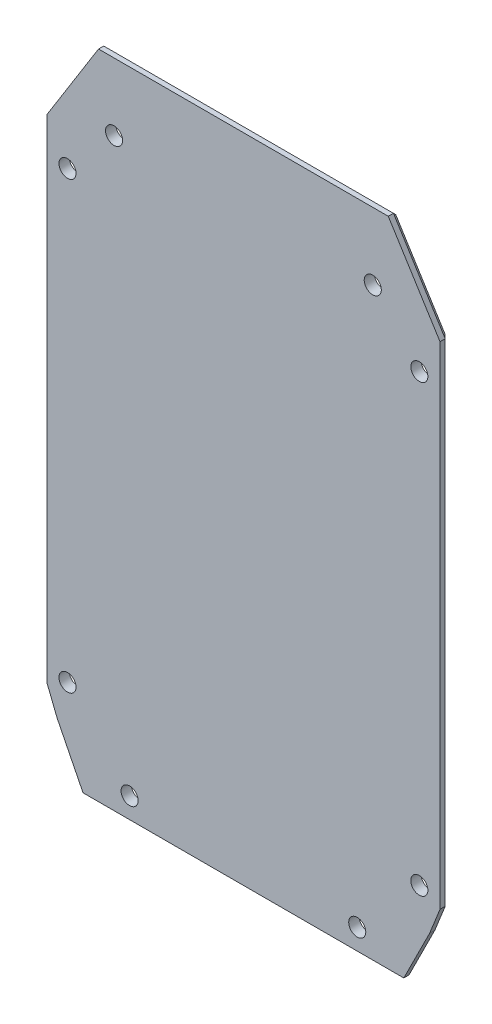
ISO-10303-21;
HEADER;
FILE_DESCRIPTION(('STEP AP214'),'2;1');
FILE_NAME('part.step','',(''),(''),'','','');
FILE_SCHEMA(('AUTOMOTIVE_DESIGN { 1 0 10303 214 1 1 1 1 }'));
ENDSEC;
DATA;
#1=APPLICATION_CONTEXT('core data for automotive mechanical design processes');
#2=APPLICATION_PROTOCOL_DEFINITION('international standard','automotive_design',2000,#1);
#3=PRODUCT_CONTEXT('',#1,'mechanical');
#4=PRODUCT('Part','Part','',(#3));
#5=PRODUCT_RELATED_PRODUCT_CATEGORY('part','',(#4));
#6=PRODUCT_DEFINITION_FORMATION('','',#4);
#7=PRODUCT_DEFINITION_CONTEXT('part definition',#1,'design');
#8=PRODUCT_DEFINITION('design','',#6,#7);
#9=PRODUCT_DEFINITION_SHAPE('','',#8);
#10=(LENGTH_UNIT() NAMED_UNIT(*) SI_UNIT(.MILLI.,.METRE.));
#11=(NAMED_UNIT(*) PLANE_ANGLE_UNIT() SI_UNIT($,.RADIAN.));
#12=(NAMED_UNIT(*) SI_UNIT($,.STERADIAN.) SOLID_ANGLE_UNIT());
#13=UNCERTAINTY_MEASURE_WITH_UNIT(LENGTH_MEASURE(1.E-05),#10,'distance_accuracy_value','');
#14=(GEOMETRIC_REPRESENTATION_CONTEXT(3) GLOBAL_UNCERTAINTY_ASSIGNED_CONTEXT((#13)) GLOBAL_UNIT_ASSIGNED_CONTEXT((#10,
#11,#12)) REPRESENTATION_CONTEXT('',''));
#15=CARTESIAN_POINT('',(0.,0.,0.));
#16=DIRECTION('',(0.,0.,1.));
#17=DIRECTION('',(1.,0.,0.));
#18=AXIS2_PLACEMENT_3D('',#15,#16,#17);
#19=CARTESIAN_POINT('',(0.,0.,2.));
#20=DIRECTION('',(0.,0.,1.));
#21=DIRECTION('',(1.,0.,0.));
#22=AXIS2_PLACEMENT_3D('',#19,#20,#21);
#23=PLANE('',#22);
#24=CARTESIAN_POINT('',(34.,-43.,2.));
#25=DIRECTION('',(0.,0.,1.));
#26=DIRECTION('',(1.,0.,0.));
#27=AXIS2_PLACEMENT_3D('',#24,#25,#26);
#28=CIRCLE('',#27,1.65);
#29=CARTESIAN_POINT('',(35.65,-43.,2.));
#30=VERTEX_POINT('',#29);
#31=EDGE_CURVE('E262',#30,#30,#28,.T.);
#32=ORIENTED_EDGE('',*,*,#31,.F.);
#33=EDGE_LOOP('',(#32));
#34=FACE_BOUND('',#33,.T.);
#35=CARTESIAN_POINT('',(22.,-56.,2.));
#36=DIRECTION('',(0.,0.,1.));
#37=DIRECTION('',(1.,0.,0.));
#38=AXIS2_PLACEMENT_3D('',#35,#36,#37);
#39=CIRCLE('',#38,1.65);
#40=CARTESIAN_POINT('',(23.65,-56.,2.));
#41=VERTEX_POINT('',#40);
#42=EDGE_CURVE('E274',#41,#41,#39,.T.);
#43=ORIENTED_EDGE('',*,*,#42,.F.);
#44=EDGE_LOOP('',(#43));
#45=FACE_BOUND('',#44,.T.);
#46=CARTESIAN_POINT('',(-34.,-43.,2.));
#47=DIRECTION('',(0.,0.,1.));
#48=DIRECTION('',(1.,0.,0.));
#49=AXIS2_PLACEMENT_3D('',#46,#47,#48);
#50=CIRCLE('',#49,1.65);
#51=CARTESIAN_POINT('',(-32.35,-43.,2.));
#52=VERTEX_POINT('',#51);
#53=EDGE_CURVE('E286',#52,#52,#50,.T.);
#54=ORIENTED_EDGE('',*,*,#53,.F.);
#55=EDGE_LOOP('',(#54));
#56=FACE_BOUND('',#55,.T.);
#57=CARTESIAN_POINT('',(-22.,-56.,2.));
#58=DIRECTION('',(0.,0.,1.));
#59=DIRECTION('',(1.,0.,0.));
#60=AXIS2_PLACEMENT_3D('',#57,#58,#59);
#61=CIRCLE('',#60,1.65);
#62=CARTESIAN_POINT('',(-20.35,-56.,2.));
#63=VERTEX_POINT('',#62);
#64=EDGE_CURVE('E173',#63,#63,#61,.T.);
#65=ORIENTED_EDGE('',*,*,#64,.F.);
#66=EDGE_LOOP('',(#65));
#67=FACE_BOUND('',#66,.T.);
#68=DIRECTION('',(0.447213595499958,-0.894427190999916,0.));
#69=VECTOR('',#68,1.);
#70=CARTESIAN_POINT('',(-36.,-50.,2.));
#71=LINE('',#70,#69);
#72=CARTESIAN_POINT('',(-36.,-50.,2.));
#73=VERTEX_POINT('',#72);
#74=CARTESIAN_POINT('',(-31.,-60.,2.));
#75=VERTEX_POINT('',#74);
#76=EDGE_CURVE('E164',#73,#75,#71,.T.);
#77=ORIENTED_EDGE('',*,*,#76,.T.);
#78=DIRECTION('',(1.,0.,0.));
#79=VECTOR('',#78,1.);
#80=CARTESIAN_POINT('',(-31.,-60.,2.));
#81=LINE('',#80,#79);
#82=CARTESIAN_POINT('',(31.,-60.,2.));
#83=VERTEX_POINT('',#82);
#84=EDGE_CURVE('E154',#75,#83,#81,.T.);
#85=ORIENTED_EDGE('',*,*,#84,.T.);
#86=DIRECTION('',(0.447213595499958,0.894427190999916,0.));
#87=VECTOR('',#86,1.);
#88=CARTESIAN_POINT('',(31.,-60.,2.));
#89=LINE('',#88,#87);
#90=CARTESIAN_POINT('',(36.,-50.,2.));
#91=VERTEX_POINT('',#90);
#92=EDGE_CURVE('E163',#83,#91,#89,.T.);
#93=ORIENTED_EDGE('',*,*,#92,.T.);
#94=DIRECTION('',(0.371390676354104,0.928476690885259,0.));
#95=VECTOR('',#94,1.);
#96=CARTESIAN_POINT('',(36.,-50.,2.));
#97=LINE('',#96,#95);
#98=CARTESIAN_POINT('',(38.,-45.,2.));
#99=VERTEX_POINT('',#98);
#100=EDGE_CURVE('E303',#91,#99,#97,.T.);
#101=ORIENTED_EDGE('',*,*,#100,.T.);
#102=DIRECTION('',(0.,1.,0.));
#103=VECTOR('',#102,1.);
#104=CARTESIAN_POINT('',(38.,-45.,2.));
#105=LINE('',#104,#103);
#106=CARTESIAN_POINT('',(38.,50.,2.));
#107=VERTEX_POINT('',#106);
#108=EDGE_CURVE('E305',#99,#107,#105,.T.);
#109=ORIENTED_EDGE('',*,*,#108,.T.);
#110=DIRECTION('',(-0.52999894000318,0.847998304005088,0.));
#111=VECTOR('',#110,1.);
#112=CARTESIAN_POINT('',(38.,50.,2.));
#113=LINE('',#112,#111);
#114=CARTESIAN_POINT('',(28.,66.,2.));
#115=VERTEX_POINT('',#114);
#116=EDGE_CURVE('E307',#107,#115,#113,.T.);
#117=ORIENTED_EDGE('',*,*,#116,.T.);
#118=DIRECTION('',(-1.,0.,0.));
#119=VECTOR('',#118,1.);
#120=CARTESIAN_POINT('',(28.,66.,2.));
#121=LINE('',#120,#119);
#122=CARTESIAN_POINT('',(-28.,66.,2.));
#123=VERTEX_POINT('',#122);
#124=EDGE_CURVE('E309',#115,#123,#121,.T.);
#125=ORIENTED_EDGE('',*,*,#124,.T.);
#126=DIRECTION('',(-0.52999894000318,-0.847998304005088,0.));
#127=VECTOR('',#126,1.);
#128=CARTESIAN_POINT('',(-28.,66.,2.));
#129=LINE('',#128,#127);
#130=CARTESIAN_POINT('',(-38.,50.,2.));
#131=VERTEX_POINT('',#130);
#132=EDGE_CURVE('E311',#123,#131,#129,.T.);
#133=ORIENTED_EDGE('',*,*,#132,.T.);
#134=DIRECTION('',(0.,-1.,0.));
#135=VECTOR('',#134,1.);
#136=CARTESIAN_POINT('',(-38.,50.,2.));
#137=LINE('',#136,#135);
#138=CARTESIAN_POINT('',(-38.,-45.,2.));
#139=VERTEX_POINT('',#138);
#140=EDGE_CURVE('E313',#131,#139,#137,.T.);
#141=ORIENTED_EDGE('',*,*,#140,.T.);
#142=DIRECTION('',(0.371390676354104,-0.928476690885259,0.));
#143=VECTOR('',#142,1.);
#144=CARTESIAN_POINT('',(-38.,-45.,2.));
#145=LINE('',#144,#143);
#146=EDGE_CURVE('E169',#139,#73,#145,.T.);
#147=ORIENTED_EDGE('',*,*,#146,.T.);
#148=EDGE_LOOP('',(#77,#85,#93,#101,#109,#117,#125,#133,#141,#147));
#149=FACE_BOUND('',#148,.T.);
#150=CARTESIAN_POINT('',(-25.,53.,2.));
#151=DIRECTION('',(0.,0.,1.));
#152=DIRECTION('',(1.,0.,0.));
#153=AXIS2_PLACEMENT_3D('',#150,#151,#152);
#154=CIRCLE('',#153,1.65);
#155=CARTESIAN_POINT('',(-23.35,53.,2.));
#156=VERTEX_POINT('',#155);
#157=EDGE_CURVE('E292',#156,#156,#154,.T.);
#158=ORIENTED_EDGE('',*,*,#157,.F.);
#159=EDGE_LOOP('',(#158));
#160=FACE_BOUND('',#159,.T.);
#161=CARTESIAN_POINT('',(-34.,43.,2.));
#162=DIRECTION('',(0.,0.,1.));
#163=DIRECTION('',(1.,0.,0.));
#164=AXIS2_PLACEMENT_3D('',#161,#162,#163);
#165=CIRCLE('',#164,1.65);
#166=CARTESIAN_POINT('',(-32.35,43.,2.));
#167=VERTEX_POINT('',#166);
#168=EDGE_CURVE('E280',#167,#167,#165,.T.);
#169=ORIENTED_EDGE('',*,*,#168,.F.);
#170=EDGE_LOOP('',(#169));
#171=FACE_BOUND('',#170,.T.);
#172=CARTESIAN_POINT('',(25.,53.,2.));
#173=DIRECTION('',(0.,0.,1.));
#174=DIRECTION('',(1.,0.,0.));
#175=AXIS2_PLACEMENT_3D('',#172,#173,#174);
#176=CIRCLE('',#175,1.65);
#177=CARTESIAN_POINT('',(26.65,53.,2.));
#178=VERTEX_POINT('',#177);
#179=EDGE_CURVE('E268',#178,#178,#176,.T.);
#180=ORIENTED_EDGE('',*,*,#179,.F.);
#181=EDGE_LOOP('',(#180));
#182=FACE_BOUND('',#181,.T.);
#183=CARTESIAN_POINT('',(34.,43.,2.));
#184=DIRECTION('',(0.,0.,1.));
#185=DIRECTION('',(1.,0.,0.));
#186=AXIS2_PLACEMENT_3D('',#183,#184,#185);
#187=CIRCLE('',#186,1.65);
#188=CARTESIAN_POINT('',(35.65,43.,2.));
#189=VERTEX_POINT('',#188);
#190=EDGE_CURVE('E254',#189,#189,#187,.T.);
#191=ORIENTED_EDGE('',*,*,#190,.F.);
#192=EDGE_LOOP('',(#191));
#193=FACE_BOUND('',#192,.T.);
#194=ADVANCED_FACE('F43',(#34,#45,#56,#67,#149,#160,#171,#182,#193),#23,.T.);
#195=CARTESIAN_POINT('',(0.,0.,0.));
#196=DIRECTION('',(0.,0.,1.));
#197=DIRECTION('',(1.,0.,0.));
#198=AXIS2_PLACEMENT_3D('',#195,#196,#197);
#199=PLANE('',#198);
#200=DIRECTION('',(-1.,0.,0.));
#201=VECTOR('',#200,1.);
#202=CARTESIAN_POINT('',(0.,-59.,0.));
#203=LINE('',#202,#201);
#204=CARTESIAN_POINT('',(30.3819660112501,-59.,0.));
#205=VERTEX_POINT('',#204);
#206=CARTESIAN_POINT('',(-30.3819660112501,-59.,0.));
#207=VERTEX_POINT('',#206);
#208=EDGE_CURVE('E201',#205,#207,#203,.T.);
#209=ORIENTED_EDGE('',*,*,#208,.T.);
#210=DIRECTION('',(-0.447213595499958,0.894427190999916,0.));
#211=VECTOR('',#210,1.);
#212=CARTESIAN_POINT('',(-47.9055728090001,-23.9527864045,0.));
#213=LINE('',#212,#211);
#214=CARTESIAN_POINT('',(-35.0869711478651,-49.58998972677,0.));
#215=VERTEX_POINT('',#214);
#216=EDGE_CURVE('E203',#207,#215,#213,.T.);
#217=ORIENTED_EDGE('',*,*,#216,.T.);
#218=DIRECTION('',(-0.371390676354104,0.928476690885259,0.));
#219=VECTOR('',#218,1.);
#220=CARTESIAN_POINT('',(-47.3473853780803,-18.9389541512321,0.));
#221=LINE('',#220,#219);
#222=CARTESIAN_POINT('',(-37.,-44.8074175964327,0.));
#223=VERTEX_POINT('',#222);
#224=EDGE_CURVE('E180',#215,#223,#221,.T.);
#225=ORIENTED_EDGE('',*,*,#224,.T.);
#226=DIRECTION('',(0.,1.,0.));
#227=VECTOR('',#226,1.);
#228=CARTESIAN_POINT('',(-37.,0.,0.));
#229=LINE('',#228,#227);
#230=CARTESIAN_POINT('',(-37.,49.7132037735887,0.));
#231=VERTEX_POINT('',#230);
#232=EDGE_CURVE('E187',#223,#231,#229,.T.);
#233=ORIENTED_EDGE('',*,*,#232,.T.);
#234=DIRECTION('',(0.52999894000318,0.847998304005088,0.));
#235=VECTOR('',#234,1.);
#236=CARTESIAN_POINT('',(-48.9497545049837,30.5935965656148,0.));
#237=LINE('',#236,#235);
#238=CARTESIAN_POINT('',(-27.4457523584929,65.,0.));
#239=VERTEX_POINT('',#238);
#240=EDGE_CURVE('E189',#231,#239,#237,.T.);
#241=ORIENTED_EDGE('',*,*,#240,.T.);
#242=DIRECTION('',(1.,0.,0.));
#243=VECTOR('',#242,1.);
#244=CARTESIAN_POINT('',(0.,65.,0.));
#245=LINE('',#244,#243);
#246=CARTESIAN_POINT('',(27.4457523584929,65.,0.));
#247=VERTEX_POINT('',#246);
#248=EDGE_CURVE('E191',#239,#247,#245,.T.);
#249=ORIENTED_EDGE('',*,*,#248,.T.);
#250=DIRECTION('',(0.52999894000318,-0.847998304005088,0.));
#251=VECTOR('',#250,1.);
#252=CARTESIAN_POINT('',(48.9497545049837,30.5935965656148,0.));
#253=LINE('',#252,#251);
#254=CARTESIAN_POINT('',(37.,49.7132037735887,0.));
#255=VERTEX_POINT('',#254);
#256=EDGE_CURVE('E193',#247,#255,#253,.T.);
#257=ORIENTED_EDGE('',*,*,#256,.T.);
#258=DIRECTION('',(0.,-1.,0.));
#259=VECTOR('',#258,1.);
#260=CARTESIAN_POINT('',(37.,0.,0.));
#261=LINE('',#260,#259);
#262=CARTESIAN_POINT('',(37.,-44.8074175964327,0.));
#263=VERTEX_POINT('',#262);
#264=EDGE_CURVE('E195',#255,#263,#261,.T.);
#265=ORIENTED_EDGE('',*,*,#264,.T.);
#266=DIRECTION('',(-0.371390676354104,-0.928476690885259,0.));
#267=VECTOR('',#266,1.);
#268=CARTESIAN_POINT('',(47.3473853780803,-18.9389541512321,0.));
#269=LINE('',#268,#267);
#270=CARTESIAN_POINT('',(35.0869711478651,-49.5899897267701,0.));
#271=VERTEX_POINT('',#270);
#272=EDGE_CURVE('E197',#263,#271,#269,.T.);
#273=ORIENTED_EDGE('',*,*,#272,.T.);
#274=DIRECTION('',(-0.447213595499958,-0.894427190999916,0.));
#275=VECTOR('',#274,1.);
#276=CARTESIAN_POINT('',(47.9055728090001,-23.9527864045,0.));
#277=LINE('',#276,#275);
#278=EDGE_CURVE('E199',#271,#205,#277,.T.);
#279=ORIENTED_EDGE('',*,*,#278,.T.);
#280=EDGE_LOOP('',(#209,#217,#225,#233,#241,#249,#257,#265,#273,#279));
#281=FACE_BOUND('',#280,.T.);
#282=CARTESIAN_POINT('',(-22.,-56.,0.));
#283=DIRECTION('',(0.,0.,1.));
#284=DIRECTION('',(1.,0.,0.));
#285=AXIS2_PLACEMENT_3D('',#282,#283,#284);
#286=CIRCLE('',#285,1.65);
#287=CARTESIAN_POINT('',(-20.35,-56.,0.));
#288=VERTEX_POINT('',#287);
#289=EDGE_CURVE('E295',#288,#288,#286,.T.);
#290=ORIENTED_EDGE('',*,*,#289,.T.);
#291=EDGE_LOOP('',(#290));
#292=FACE_BOUND('',#291,.T.);
#293=CARTESIAN_POINT('',(-25.,53.,0.));
#294=DIRECTION('',(0.,0.,1.));
#295=DIRECTION('',(1.,0.,0.));
#296=AXIS2_PLACEMENT_3D('',#293,#294,#295);
#297=CIRCLE('',#296,1.65);
#298=CARTESIAN_POINT('',(-23.35,53.,0.));
#299=VERTEX_POINT('',#298);
#300=EDGE_CURVE('E289',#299,#299,#297,.T.);
#301=ORIENTED_EDGE('',*,*,#300,.T.);
#302=EDGE_LOOP('',(#301));
#303=FACE_BOUND('',#302,.T.);
#304=CARTESIAN_POINT('',(-34.,-43.,0.));
#305=DIRECTION('',(0.,0.,1.));
#306=DIRECTION('',(1.,0.,0.));
#307=AXIS2_PLACEMENT_3D('',#304,#305,#306);
#308=CIRCLE('',#307,1.65);
#309=CARTESIAN_POINT('',(-32.35,-43.,0.));
#310=VERTEX_POINT('',#309);
#311=EDGE_CURVE('E283',#310,#310,#308,.T.);
#312=ORIENTED_EDGE('',*,*,#311,.T.);
#313=EDGE_LOOP('',(#312));
#314=FACE_BOUND('',#313,.T.);
#315=CARTESIAN_POINT('',(-34.,43.,0.));
#316=DIRECTION('',(0.,0.,1.));
#317=DIRECTION('',(1.,0.,0.));
#318=AXIS2_PLACEMENT_3D('',#315,#316,#317);
#319=CIRCLE('',#318,1.65);
#320=CARTESIAN_POINT('',(-32.35,43.,0.));
#321=VERTEX_POINT('',#320);
#322=EDGE_CURVE('E277',#321,#321,#319,.T.);
#323=ORIENTED_EDGE('',*,*,#322,.T.);
#324=EDGE_LOOP('',(#323));
#325=FACE_BOUND('',#324,.T.);
#326=CARTESIAN_POINT('',(22.,-56.,0.));
#327=DIRECTION('',(0.,0.,1.));
#328=DIRECTION('',(1.,0.,0.));
#329=AXIS2_PLACEMENT_3D('',#326,#327,#328);
#330=CIRCLE('',#329,1.65);
#331=CARTESIAN_POINT('',(23.65,-56.,0.));
#332=VERTEX_POINT('',#331);
#333=EDGE_CURVE('E271',#332,#332,#330,.T.);
#334=ORIENTED_EDGE('',*,*,#333,.T.);
#335=EDGE_LOOP('',(#334));
#336=FACE_BOUND('',#335,.T.);
#337=CARTESIAN_POINT('',(25.,53.,0.));
#338=DIRECTION('',(0.,0.,1.));
#339=DIRECTION('',(1.,0.,0.));
#340=AXIS2_PLACEMENT_3D('',#337,#338,#339);
#341=CIRCLE('',#340,1.65);
#342=CARTESIAN_POINT('',(26.65,53.,0.));
#343=VERTEX_POINT('',#342);
#344=EDGE_CURVE('E265',#343,#343,#341,.T.);
#345=ORIENTED_EDGE('',*,*,#344,.T.);
#346=EDGE_LOOP('',(#345));
#347=FACE_BOUND('',#346,.T.);
#348=CARTESIAN_POINT('',(34.,-43.,0.));
#349=DIRECTION('',(0.,0.,1.));
#350=DIRECTION('',(1.,0.,0.));
#351=AXIS2_PLACEMENT_3D('',#348,#349,#350);
#352=CIRCLE('',#351,1.65);
#353=CARTESIAN_POINT('',(35.65,-43.,0.));
#354=VERTEX_POINT('',#353);
#355=EDGE_CURVE('E259',#354,#354,#352,.T.);
#356=ORIENTED_EDGE('',*,*,#355,.T.);
#357=EDGE_LOOP('',(#356));
#358=FACE_BOUND('',#357,.T.);
#359=CARTESIAN_POINT('',(34.,43.,0.));
#360=DIRECTION('',(0.,0.,1.));
#361=DIRECTION('',(1.,0.,0.));
#362=AXIS2_PLACEMENT_3D('',#359,#360,#361);
#363=CIRCLE('',#362,1.65);
#364=CARTESIAN_POINT('',(35.65,43.,0.));
#365=VERTEX_POINT('',#364);
#366=EDGE_CURVE('E248',#365,#365,#363,.T.);
#367=ORIENTED_EDGE('',*,*,#366,.T.);
#368=EDGE_LOOP('',(#367));
#369=FACE_BOUND('',#368,.T.);
#370=ADVANCED_FACE('F352',(#281,#292,#303,#314,#325,#336,#347,#358,#369),#199,.F.);
#371=CARTESIAN_POINT('',(-36.,-50.,2.));
#372=DIRECTION('',(0.894427190999916,0.447213595499958,0.));
#373=DIRECTION('',(-0.447213595499958,0.894427190999916,0.));
#374=AXIS2_PLACEMENT_3D('',#371,#372,#373);
#375=PLANE('',#374);
#376=DIRECTION('',(0.,0.,-1.));
#377=VECTOR('',#376,1.);
#378=CARTESIAN_POINT('',(-36.,-50.,2.));
#379=LINE('',#378,#377);
#380=CARTESIAN_POINT('',(-36.,-50.,0.999999999999987));
#381=VERTEX_POINT('',#380);
#382=EDGE_CURVE('E316',#73,#381,#379,.T.);
#383=ORIENTED_EDGE('',*,*,#382,.T.);
#384=DIRECTION('',(0.447213595499958,-0.894427190999916,0.));
#385=VECTOR('',#384,1.);
#386=CARTESIAN_POINT('',(-36.,-50.,0.999999999999987));
#387=LINE('',#386,#385);
#388=CARTESIAN_POINT('',(-31.,-60.,0.999999999999987));
#389=VERTEX_POINT('',#388);
#390=EDGE_CURVE('E178',#381,#389,#387,.T.);
#391=ORIENTED_EDGE('',*,*,#390,.T.);
#392=DIRECTION('',(0.,0.,-1.));
#393=VECTOR('',#392,1.);
#394=CARTESIAN_POINT('',(-31.,-60.,2.));
#395=LINE('',#394,#393);
#396=EDGE_CURVE('E158',#75,#389,#395,.T.);
#397=ORIENTED_EDGE('',*,*,#396,.F.);
#398=ORIENTED_EDGE('',*,*,#76,.F.);
#399=EDGE_LOOP('',(#383,#391,#397,#398));
#400=FACE_BOUND('',#399,.T.);
#401=ADVANCED_FACE('F176',(#400),#375,.F.);
#402=CARTESIAN_POINT('',(-31.,-60.,2.));
#403=DIRECTION('',(0.,1.,0.));
#404=DIRECTION('',(0.,0.,1.));
#405=AXIS2_PLACEMENT_3D('',#402,#403,#404);
#406=PLANE('',#405);
#407=ORIENTED_EDGE('',*,*,#396,.T.);
#408=DIRECTION('',(1.,0.,0.));
#409=VECTOR('',#408,1.);
#410=CARTESIAN_POINT('',(-31.,-60.,0.999999999999987));
#411=LINE('',#410,#409);
#412=CARTESIAN_POINT('',(31.,-60.,0.999999999999987));
#413=VERTEX_POINT('',#412);
#414=EDGE_CURVE('E206',#389,#413,#411,.T.);
#415=ORIENTED_EDGE('',*,*,#414,.T.);
#416=DIRECTION('',(0.,0.,-1.));
#417=VECTOR('',#416,1.);
#418=CARTESIAN_POINT('',(31.,-60.,2.));
#419=LINE('',#418,#417);
#420=EDGE_CURVE('E160',#83,#413,#419,.T.);
#421=ORIENTED_EDGE('',*,*,#420,.F.);
#422=ORIENTED_EDGE('',*,*,#84,.F.);
#423=EDGE_LOOP('',(#407,#415,#421,#422));
#424=FACE_BOUND('',#423,.T.);
#425=ADVANCED_FACE('F156',(#424),#406,.F.);
#426=CARTESIAN_POINT('',(31.,-60.,2.));
#427=DIRECTION('',(-0.894427190999916,0.447213595499958,0.));
#428=DIRECTION('',(-0.447213595499958,-0.894427190999916,0.));
#429=AXIS2_PLACEMENT_3D('',#426,#427,#428);
#430=PLANE('',#429);
#431=ORIENTED_EDGE('',*,*,#420,.T.);
#432=DIRECTION('',(0.447213595499958,0.894427190999916,0.));
#433=VECTOR('',#432,1.);
#434=CARTESIAN_POINT('',(31.,-60.,0.999999999999987));
#435=LINE('',#434,#433);
#436=CARTESIAN_POINT('',(36.,-50.,0.999999999999987));
#437=VERTEX_POINT('',#436);
#438=EDGE_CURVE('E208',#413,#437,#435,.T.);
#439=ORIENTED_EDGE('',*,*,#438,.T.);
#440=DIRECTION('',(0.,0.,-1.));
#441=VECTOR('',#440,1.);
#442=CARTESIAN_POINT('',(36.,-50.,2.));
#443=LINE('',#442,#441);
#444=EDGE_CURVE('E182',#91,#437,#443,.T.);
#445=ORIENTED_EDGE('',*,*,#444,.F.);
#446=ORIENTED_EDGE('',*,*,#92,.F.);
#447=EDGE_LOOP('',(#431,#439,#445,#446));
#448=FACE_BOUND('',#447,.T.);
#449=ADVANCED_FACE('F376',(#448),#430,.F.);
#450=CARTESIAN_POINT('',(36.,-50.,2.));
#451=DIRECTION('',(-0.928476690885259,0.371390676354104,0.));
#452=DIRECTION('',(-0.371390676354104,-0.928476690885259,0.));
#453=AXIS2_PLACEMENT_3D('',#450,#451,#452);
#454=PLANE('',#453);
#455=ORIENTED_EDGE('',*,*,#444,.T.);
#456=DIRECTION('',(0.371390676354104,0.928476690885259,0.));
#457=VECTOR('',#456,1.);
#458=CARTESIAN_POINT('',(36.,-50.,0.999999999999987));
#459=LINE('',#458,#457);
#460=CARTESIAN_POINT('',(38.,-45.,0.999999999999987));
#461=VERTEX_POINT('',#460);
#462=EDGE_CURVE('E210',#437,#461,#459,.T.);
#463=ORIENTED_EDGE('',*,*,#462,.T.);
#464=DIRECTION('',(0.,0.,-1.));
#465=VECTOR('',#464,1.);
#466=CARTESIAN_POINT('',(38.,-45.,2.));
#467=LINE('',#466,#465);
#468=EDGE_CURVE('E330',#99,#461,#467,.T.);
#469=ORIENTED_EDGE('',*,*,#468,.F.);
#470=ORIENTED_EDGE('',*,*,#100,.F.);
#471=EDGE_LOOP('',(#455,#463,#469,#470));
#472=FACE_BOUND('',#471,.T.);
#473=ADVANCED_FACE('F337',(#472),#454,.F.);
#474=CARTESIAN_POINT('',(38.,-45.,2.));
#475=DIRECTION('',(-1.,0.,0.));
#476=DIRECTION('',(0.,0.,1.));
#477=AXIS2_PLACEMENT_3D('',#474,#475,#476);
#478=PLANE('',#477);
#479=ORIENTED_EDGE('',*,*,#468,.T.);
#480=DIRECTION('',(0.,1.,0.));
#481=VECTOR('',#480,1.);
#482=CARTESIAN_POINT('',(38.,-45.,0.999999999999987));
#483=LINE('',#482,#481);
#484=CARTESIAN_POINT('',(38.,50.,0.999999999999984));
#485=VERTEX_POINT('',#484);
#486=EDGE_CURVE('E212',#461,#485,#483,.T.);
#487=ORIENTED_EDGE('',*,*,#486,.T.);
#488=DIRECTION('',(0.,0.,-1.));
#489=VECTOR('',#488,1.);
#490=CARTESIAN_POINT('',(38.,50.,2.));
#491=LINE('',#490,#489);
#492=EDGE_CURVE('E327',#107,#485,#491,.T.);
#493=ORIENTED_EDGE('',*,*,#492,.F.);
#494=ORIENTED_EDGE('',*,*,#108,.F.);
#495=EDGE_LOOP('',(#479,#487,#493,#494));
#496=FACE_BOUND('',#495,.T.);
#497=ADVANCED_FACE('F359',(#496),#478,.F.);
#498=CARTESIAN_POINT('',(38.,50.,2.));
#499=DIRECTION('',(-0.847998304005088,-0.52999894000318,0.));
#500=DIRECTION('',(0.52999894000318,-0.847998304005088,0.));
#501=AXIS2_PLACEMENT_3D('',#498,#499,#500);
#502=PLANE('',#501);
#503=ORIENTED_EDGE('',*,*,#492,.T.);
#504=DIRECTION('',(-0.52999894000318,0.847998304005088,0.));
#505=VECTOR('',#504,1.);
#506=CARTESIAN_POINT('',(38.,50.,0.999999999999984));
#507=LINE('',#506,#505);
#508=CARTESIAN_POINT('',(28.,66.,0.999999999999987));
#509=VERTEX_POINT('',#508);
#510=EDGE_CURVE('E214',#485,#509,#507,.T.);
#511=ORIENTED_EDGE('',*,*,#510,.T.);
#512=DIRECTION('',(0.,0.,-1.));
#513=VECTOR('',#512,1.);
#514=CARTESIAN_POINT('',(28.,66.,2.));
#515=LINE('',#514,#513);
#516=EDGE_CURVE('E324',#115,#509,#515,.T.);
#517=ORIENTED_EDGE('',*,*,#516,.F.);
#518=ORIENTED_EDGE('',*,*,#116,.F.);
#519=EDGE_LOOP('',(#503,#511,#517,#518));
#520=FACE_BOUND('',#519,.T.);
#521=ADVANCED_FACE('F364',(#520),#502,.F.);
#522=CARTESIAN_POINT('',(28.,66.,2.));
#523=DIRECTION('',(0.,-1.,0.));
#524=DIRECTION('',(0.,0.,-1.));
#525=AXIS2_PLACEMENT_3D('',#522,#523,#524);
#526=PLANE('',#525);
#527=ORIENTED_EDGE('',*,*,#516,.T.);
#528=DIRECTION('',(-1.,0.,0.));
#529=VECTOR('',#528,1.);
#530=CARTESIAN_POINT('',(28.,66.,0.999999999999987));
#531=LINE('',#530,#529);
#532=CARTESIAN_POINT('',(-28.,66.,0.999999999999988));
#533=VERTEX_POINT('',#532);
#534=EDGE_CURVE('E216',#509,#533,#531,.T.);
#535=ORIENTED_EDGE('',*,*,#534,.T.);
#536=DIRECTION('',(0.,0.,-1.));
#537=VECTOR('',#536,1.);
#538=CARTESIAN_POINT('',(-28.,66.,2.));
#539=LINE('',#538,#537);
#540=EDGE_CURVE('E322',#123,#533,#539,.T.);
#541=ORIENTED_EDGE('',*,*,#540,.F.);
#542=ORIENTED_EDGE('',*,*,#124,.F.);
#543=EDGE_LOOP('',(#527,#535,#541,#542));
#544=FACE_BOUND('',#543,.T.);
#545=ADVANCED_FACE('F371',(#544),#526,.F.);
#546=CARTESIAN_POINT('',(-28.,66.,2.));
#547=DIRECTION('',(0.847998304005088,-0.52999894000318,0.));
#548=DIRECTION('',(0.52999894000318,0.847998304005088,0.));
#549=AXIS2_PLACEMENT_3D('',#546,#547,#548);
#550=PLANE('',#549);
#551=ORIENTED_EDGE('',*,*,#540,.T.);
#552=DIRECTION('',(-0.52999894000318,-0.847998304005088,0.));
#553=VECTOR('',#552,1.);
#554=CARTESIAN_POINT('',(-28.,66.,0.999999999999988));
#555=LINE('',#554,#553);
#556=CARTESIAN_POINT('',(-38.,50.,0.999999999999987));
#557=VERTEX_POINT('',#556);
#558=EDGE_CURVE('E68',#533,#557,#555,.T.);
#559=ORIENTED_EDGE('',*,*,#558,.T.);
#560=DIRECTION('',(0.,0.,-1.));
#561=VECTOR('',#560,1.);
#562=CARTESIAN_POINT('',(-38.,50.,2.));
#563=LINE('',#562,#561);
#564=EDGE_CURVE('E320',#131,#557,#563,.T.);
#565=ORIENTED_EDGE('',*,*,#564,.F.);
#566=ORIENTED_EDGE('',*,*,#132,.F.);
#567=EDGE_LOOP('',(#551,#559,#565,#566));
#568=FACE_BOUND('',#567,.T.);
#569=ADVANCED_FACE('F374',(#568),#550,.F.);
#570=CARTESIAN_POINT('',(-38.,50.,2.));
#571=DIRECTION('',(1.,0.,0.));
#572=DIRECTION('',(0.,0.,-1.));
#573=AXIS2_PLACEMENT_3D('',#570,#571,#572);
#574=PLANE('',#573);
#575=ORIENTED_EDGE('',*,*,#564,.T.);
#576=DIRECTION('',(0.,-1.,0.));
#577=VECTOR('',#576,1.);
#578=CARTESIAN_POINT('',(-38.,50.,0.999999999999987));
#579=LINE('',#578,#577);
#580=CARTESIAN_POINT('',(-38.,-45.,0.999999999999987));
#581=VERTEX_POINT('',#580);
#582=EDGE_CURVE('E53',#557,#581,#579,.T.);
#583=ORIENTED_EDGE('',*,*,#582,.T.);
#584=DIRECTION('',(0.,0.,-1.));
#585=VECTOR('',#584,1.);
#586=CARTESIAN_POINT('',(-38.,-45.,2.));
#587=LINE('',#586,#585);
#588=EDGE_CURVE('E318',#139,#581,#587,.T.);
#589=ORIENTED_EDGE('',*,*,#588,.F.);
#590=ORIENTED_EDGE('',*,*,#140,.F.);
#591=EDGE_LOOP('',(#575,#583,#589,#590));
#592=FACE_BOUND('',#591,.T.);
#593=ADVANCED_FACE('F401',(#592),#574,.F.);
#594=CARTESIAN_POINT('',(-38.,-45.,2.));
#595=DIRECTION('',(0.928476690885259,0.371390676354104,0.));
#596=DIRECTION('',(-0.371390676354104,0.928476690885259,0.));
#597=AXIS2_PLACEMENT_3D('',#594,#595,#596);
#598=PLANE('',#597);
#599=ORIENTED_EDGE('',*,*,#588,.T.);
#600=DIRECTION('',(0.371390676354104,-0.928476690885259,0.));
#601=VECTOR('',#600,1.);
#602=CARTESIAN_POINT('',(-38.,-45.,0.999999999999987));
#603=LINE('',#602,#601);
#604=EDGE_CURVE('E11',#581,#381,#603,.T.);
#605=ORIENTED_EDGE('',*,*,#604,.T.);
#606=ORIENTED_EDGE('',*,*,#382,.F.);
#607=ORIENTED_EDGE('',*,*,#146,.F.);
#608=EDGE_LOOP('',(#599,#605,#606,#607));
#609=FACE_BOUND('',#608,.T.);
#610=ADVANCED_FACE('F398',(#609),#598,.F.);
#611=CARTESIAN_POINT('',(-22.,-56.,2.));
#612=DIRECTION('',(0.,0.,-1.));
#613=DIRECTION('',(-1.,0.,0.));
#614=AXIS2_PLACEMENT_3D('',#611,#612,#613);
#615=CYLINDRICAL_SURFACE('',#614,1.65);
#616=ORIENTED_EDGE('',*,*,#64,.T.);
#617=EDGE_LOOP('',(#616));
#618=FACE_BOUND('',#617,.T.);
#619=ORIENTED_EDGE('',*,*,#289,.F.);
#620=EDGE_LOOP('',(#619));
#621=FACE_BOUND('',#620,.T.);
#622=ADVANCED_FACE('F395',(#618,#621),#615,.F.);
#623=CARTESIAN_POINT('',(-25.,53.,2.));
#624=DIRECTION('',(0.,0.,-1.));
#625=DIRECTION('',(-1.,0.,0.));
#626=AXIS2_PLACEMENT_3D('',#623,#624,#625);
#627=CYLINDRICAL_SURFACE('',#626,1.65);
#628=ORIENTED_EDGE('',*,*,#157,.T.);
#629=EDGE_LOOP('',(#628));
#630=FACE_BOUND('',#629,.T.);
#631=ORIENTED_EDGE('',*,*,#300,.F.);
#632=EDGE_LOOP('',(#631));
#633=FACE_BOUND('',#632,.T.);
#634=ADVANCED_FACE('F443',(#630,#633),#627,.F.);
#635=CARTESIAN_POINT('',(-34.,-43.,2.));
#636=DIRECTION('',(0.,0.,-1.));
#637=DIRECTION('',(-1.,0.,0.));
#638=AXIS2_PLACEMENT_3D('',#635,#636,#637);
#639=CYLINDRICAL_SURFACE('',#638,1.65);
#640=ORIENTED_EDGE('',*,*,#53,.T.);
#641=EDGE_LOOP('',(#640));
#642=FACE_BOUND('',#641,.T.);
#643=ORIENTED_EDGE('',*,*,#311,.F.);
#644=EDGE_LOOP('',(#643));
#645=FACE_BOUND('',#644,.T.);
#646=ADVANCED_FACE('F450',(#642,#645),#639,.F.);
#647=CARTESIAN_POINT('',(-34.,43.,2.));
#648=DIRECTION('',(0.,0.,-1.));
#649=DIRECTION('',(-1.,0.,0.));
#650=AXIS2_PLACEMENT_3D('',#647,#648,#649);
#651=CYLINDRICAL_SURFACE('',#650,1.65);
#652=ORIENTED_EDGE('',*,*,#168,.T.);
#653=EDGE_LOOP('',(#652));
#654=FACE_BOUND('',#653,.T.);
#655=ORIENTED_EDGE('',*,*,#322,.F.);
#656=EDGE_LOOP('',(#655));
#657=FACE_BOUND('',#656,.T.);
#658=ADVANCED_FACE('F457',(#654,#657),#651,.F.);
#659=CARTESIAN_POINT('',(22.,-56.,2.));
#660=DIRECTION('',(0.,0.,-1.));
#661=DIRECTION('',(-1.,0.,0.));
#662=AXIS2_PLACEMENT_3D('',#659,#660,#661);
#663=CYLINDRICAL_SURFACE('',#662,1.65);
#664=ORIENTED_EDGE('',*,*,#42,.T.);
#665=EDGE_LOOP('',(#664));
#666=FACE_BOUND('',#665,.T.);
#667=ORIENTED_EDGE('',*,*,#333,.F.);
#668=EDGE_LOOP('',(#667));
#669=FACE_BOUND('',#668,.T.);
#670=ADVANCED_FACE('F465',(#666,#669),#663,.F.);
#671=CARTESIAN_POINT('',(25.,53.,2.));
#672=DIRECTION('',(0.,0.,-1.));
#673=DIRECTION('',(-1.,0.,0.));
#674=AXIS2_PLACEMENT_3D('',#671,#672,#673);
#675=CYLINDRICAL_SURFACE('',#674,1.65);
#676=ORIENTED_EDGE('',*,*,#179,.T.);
#677=EDGE_LOOP('',(#676));
#678=FACE_BOUND('',#677,.T.);
#679=ORIENTED_EDGE('',*,*,#344,.F.);
#680=EDGE_LOOP('',(#679));
#681=FACE_BOUND('',#680,.T.);
#682=ADVANCED_FACE('F473',(#678,#681),#675,.F.);
#683=CARTESIAN_POINT('',(34.,-43.,2.));
#684=DIRECTION('',(0.,0.,-1.));
#685=DIRECTION('',(-1.,0.,0.));
#686=AXIS2_PLACEMENT_3D('',#683,#684,#685);
#687=CYLINDRICAL_SURFACE('',#686,1.65);
#688=ORIENTED_EDGE('',*,*,#31,.T.);
#689=EDGE_LOOP('',(#688));
#690=FACE_BOUND('',#689,.T.);
#691=ORIENTED_EDGE('',*,*,#355,.F.);
#692=EDGE_LOOP('',(#691));
#693=FACE_BOUND('',#692,.T.);
#694=ADVANCED_FACE('F481',(#690,#693),#687,.F.);
#695=CARTESIAN_POINT('',(34.,43.,2.));
#696=DIRECTION('',(0.,0.,-1.));
#697=DIRECTION('',(-1.,0.,0.));
#698=AXIS2_PLACEMENT_3D('',#695,#696,#697);
#699=CYLINDRICAL_SURFACE('',#698,1.65);
#700=ORIENTED_EDGE('',*,*,#190,.T.);
#701=EDGE_LOOP('',(#700));
#702=FACE_BOUND('',#701,.T.);
#703=ORIENTED_EDGE('',*,*,#366,.F.);
#704=EDGE_LOOP('',(#703));
#705=FACE_BOUND('',#704,.T.);
#706=ADVANCED_FACE('F489',(#702,#705),#699,.F.);
#707=CARTESIAN_POINT('',(38.,50.,0.999999999999987));
#708=DIRECTION('',(-0.599625351196685,-0.374765844497928,0.707106781186552));
#709=DIRECTION('',(-0.52999894000318,0.847998304005088,0.));
#710=AXIS2_PLACEMENT_3D('',#707,#708,#709);
#711=PLANE('',#710);
#712=DIRECTION('',(-0.693000181219913,-0.19874983687625,-0.693000181219913));
#713=VECTOR('',#712,1.);
#714=CARTESIAN_POINT('',(38.,50.,0.999999999999987));
#715=LINE('',#714,#713);
#716=EDGE_CURVE('E241',#255,#485,#715,.F.);
#717=ORIENTED_EDGE('',*,*,#716,.F.);
#718=ORIENTED_EDGE('',*,*,#256,.F.);
#719=DIRECTION('',(-0.364890142623934,-0.658352179238394,-0.658352179238394));
#720=VECTOR('',#719,1.);
#721=CARTESIAN_POINT('',(28.,66.,0.999999999999987));
#722=LINE('',#721,#720);
#723=EDGE_CURVE('E48',#509,#247,#722,.T.);
#724=ORIENTED_EDGE('',*,*,#723,.F.);
#725=ORIENTED_EDGE('',*,*,#510,.F.);
#726=EDGE_LOOP('',(#717,#718,#724,#725));
#727=FACE_BOUND('',#726,.T.);
#728=ADVANCED_FACE('F46',(#727),#711,.F.);
#729=CARTESIAN_POINT('',(28.,66.,0.999999999999987));
#730=DIRECTION('',(0.,-0.707106781186547,0.707106781186547));
#731=DIRECTION('',(-1.,0.,0.));
#732=AXIS2_PLACEMENT_3D('',#729,#730,#731);
#733=PLANE('',#732);
#734=ORIENTED_EDGE('',*,*,#723,.T.);
#735=ORIENTED_EDGE('',*,*,#248,.F.);
#736=DIRECTION('',(0.364890142623922,-0.658352179238397,-0.658352179238397));
#737=VECTOR('',#736,1.);
#738=CARTESIAN_POINT('',(-28.,66.,0.999999999999987));
#739=LINE('',#738,#737);
#740=EDGE_CURVE('E239',#533,#239,#739,.T.);
#741=ORIENTED_EDGE('',*,*,#740,.F.);
#742=ORIENTED_EDGE('',*,*,#534,.F.);
#743=EDGE_LOOP('',(#734,#735,#741,#742));
#744=FACE_BOUND('',#743,.T.);
#745=ADVANCED_FACE('F368',(#744),#733,.F.);
#746=CARTESIAN_POINT('',(38.,-45.,0.999999999999987));
#747=DIRECTION('',(-0.707106781186547,0.,0.707106781186547));
#748=DIRECTION('',(0.,1.,0.));
#749=AXIS2_PLACEMENT_3D('',#746,#747,#748);
#750=PLANE('',#749);
#751=ORIENTED_EDGE('',*,*,#716,.T.);
#752=ORIENTED_EDGE('',*,*,#486,.F.);
#753=DIRECTION('',(-0.700640288494482,0.134930990794327,-0.700640288494482));
#754=VECTOR('',#753,1.);
#755=CARTESIAN_POINT('',(38.,-45.,0.999999999999987));
#756=LINE('',#755,#754);
#757=EDGE_CURVE('E236',#263,#461,#756,.F.);
#758=ORIENTED_EDGE('',*,*,#757,.F.);
#759=ORIENTED_EDGE('',*,*,#264,.F.);
#760=EDGE_LOOP('',(#751,#752,#758,#759));
#761=FACE_BOUND('',#760,.T.);
#762=ADVANCED_FACE('F356',(#761),#750,.F.);
#763=CARTESIAN_POINT('',(-28.,66.,0.999999999999987));
#764=DIRECTION('',(0.59962535119669,-0.374765844497931,0.707106781186546));
#765=DIRECTION('',(-0.52999894000318,-0.847998304005088,0.));
#766=AXIS2_PLACEMENT_3D('',#763,#764,#765);
#767=PLANE('',#766);
#768=ORIENTED_EDGE('',*,*,#740,.T.);
#769=ORIENTED_EDGE('',*,*,#240,.F.);
#770=DIRECTION('',(0.693000181219916,-0.198749836876228,-0.693000181219916));
#771=VECTOR('',#770,1.);
#772=CARTESIAN_POINT('',(-38.,50.,0.999999999999987));
#773=LINE('',#772,#771);
#774=EDGE_CURVE('E233',#557,#231,#773,.T.);
#775=ORIENTED_EDGE('',*,*,#774,.F.);
#776=ORIENTED_EDGE('',*,*,#558,.F.);
#777=EDGE_LOOP('',(#768,#769,#775,#776));
#778=FACE_BOUND('',#777,.T.);
#779=ADVANCED_FACE('F514',(#778),#767,.F.);
#780=CARTESIAN_POINT('',(36.,-50.,0.999999999999987));
#781=DIRECTION('',(-0.656532164298612,0.262612865719445,0.707106781186549));
#782=DIRECTION('',(0.371390676354104,0.928476690885259,0.));
#783=AXIS2_PLACEMENT_3D('',#780,#781,#782);
#784=PLANE('',#783);
#785=ORIENTED_EDGE('',*,*,#757,.T.);
#786=ORIENTED_EDGE('',*,*,#462,.F.);
#787=DIRECTION('',(-0.645329830367133,0.289795727104988,-0.706801136522869));
#788=VECTOR('',#787,1.);
#789=CARTESIAN_POINT('',(36.,-50.,0.999999999999987));
#790=LINE('',#789,#788);
#791=EDGE_CURVE('E230',#271,#437,#790,.F.);
#792=ORIENTED_EDGE('',*,*,#791,.F.);
#793=ORIENTED_EDGE('',*,*,#272,.F.);
#794=EDGE_LOOP('',(#785,#786,#792,#793));
#795=FACE_BOUND('',#794,.T.);
#796=ADVANCED_FACE('F342',(#795),#784,.F.);
#797=CARTESIAN_POINT('',(-38.,50.,0.999999999999987));
#798=DIRECTION('',(0.707106781186547,0.,0.707106781186547));
#799=DIRECTION('',(0.,-1.,0.));
#800=AXIS2_PLACEMENT_3D('',#797,#798,#799);
#801=PLANE('',#800);
#802=ORIENTED_EDGE('',*,*,#774,.T.);
#803=ORIENTED_EDGE('',*,*,#232,.F.);
#804=DIRECTION('',(0.700640288494482,0.134930990794324,-0.700640288494482));
#805=VECTOR('',#804,1.);
#806=CARTESIAN_POINT('',(-38.,-45.,0.999999999999987));
#807=LINE('',#806,#805);
#808=EDGE_CURVE('E227',#581,#223,#807,.T.);
#809=ORIENTED_EDGE('',*,*,#808,.F.);
#810=ORIENTED_EDGE('',*,*,#582,.F.);
#811=EDGE_LOOP('',(#802,#803,#809,#810));
#812=FACE_BOUND('',#811,.T.);
#813=ADVANCED_FACE('F528',(#812),#801,.F.);
#814=CARTESIAN_POINT('',(31.,-60.,0.999999999999987));
#815=DIRECTION('',(-0.632455532033674,0.316227766016837,0.707106781186549));
#816=DIRECTION('',(0.447213595499958,0.894427190999916,0.));
#817=AXIS2_PLACEMENT_3D('',#814,#815,#816);
#818=PLANE('',#817);
#819=ORIENTED_EDGE('',*,*,#791,.T.);
#820=ORIENTED_EDGE('',*,*,#438,.F.);
#821=DIRECTION('',(-0.400446571456082,0.647936163294298,-0.647936163294298));
#822=VECTOR('',#821,1.);
#823=CARTESIAN_POINT('',(31.,-60.,0.999999999999987));
#824=LINE('',#823,#822);
#825=EDGE_CURVE('E224',#205,#413,#824,.F.);
#826=ORIENTED_EDGE('',*,*,#825,.F.);
#827=ORIENTED_EDGE('',*,*,#278,.F.);
#828=EDGE_LOOP('',(#819,#820,#826,#827));
#829=FACE_BOUND('',#828,.T.);
#830=ADVANCED_FACE('F348',(#829),#818,.F.);
#831=CARTESIAN_POINT('',(-38.,-45.,0.999999999999987));
#832=DIRECTION('',(0.656532164298612,0.262612865719445,0.707106781186548));
#833=DIRECTION('',(0.371390676354104,-0.928476690885259,0.));
#834=AXIS2_PLACEMENT_3D('',#831,#832,#833);
#835=PLANE('',#834);
#836=ORIENTED_EDGE('',*,*,#808,.T.);
#837=ORIENTED_EDGE('',*,*,#224,.F.);
#838=DIRECTION('',(-0.645329830367126,-0.289795727105001,0.706801136522869));
#839=VECTOR('',#838,1.);
#840=CARTESIAN_POINT('',(-35.8978320428544,-49.954119837586,0.888099968684749));
#841=LINE('',#840,#839);
#842=EDGE_CURVE('E222',#381,#215,#841,.F.);
#843=ORIENTED_EDGE('',*,*,#842,.F.);
#844=ORIENTED_EDGE('',*,*,#604,.F.);
#845=EDGE_LOOP('',(#836,#837,#843,#844));
#846=FACE_BOUND('',#845,.T.);
#847=ADVANCED_FACE('F542',(#846),#835,.F.);
#848=CARTESIAN_POINT('',(-31.,-60.,0.999999999999987));
#849=DIRECTION('',(0.,0.707106781186547,0.707106781186547));
#850=DIRECTION('',(1.,0.,0.));
#851=AXIS2_PLACEMENT_3D('',#848,#849,#850);
#852=PLANE('',#851);
#853=ORIENTED_EDGE('',*,*,#825,.T.);
#854=ORIENTED_EDGE('',*,*,#414,.F.);
#855=DIRECTION('',(0.400446571456082,0.647936163294298,-0.647936163294298));
#856=VECTOR('',#855,1.);
#857=CARTESIAN_POINT('',(-31.,-60.,0.999999999999987));
#858=LINE('',#857,#856);
#859=EDGE_CURVE('E220',#207,#389,#858,.F.);
#860=ORIENTED_EDGE('',*,*,#859,.F.);
#861=ORIENTED_EDGE('',*,*,#208,.F.);
#862=EDGE_LOOP('',(#853,#854,#860,#861));
#863=FACE_BOUND('',#862,.T.);
#864=ADVANCED_FACE('F549',(#863),#852,.F.);
#865=CARTESIAN_POINT('',(-36.,-50.,0.999999999999987));
#866=DIRECTION('',(0.632455532033674,0.316227766016837,0.707106781186549));
#867=DIRECTION('',(0.447213595499958,-0.894427190999916,0.));
#868=AXIS2_PLACEMENT_3D('',#865,#866,#867);
#869=PLANE('',#868);
#870=ORIENTED_EDGE('',*,*,#842,.T.);
#871=ORIENTED_EDGE('',*,*,#216,.F.);
#872=ORIENTED_EDGE('',*,*,#859,.T.);
#873=ORIENTED_EDGE('',*,*,#390,.F.);
#874=EDGE_LOOP('',(#870,#871,#872,#873));
#875=FACE_BOUND('',#874,.T.);
#876=ADVANCED_FACE('F557',(#875),#869,.F.);
#877=CLOSED_SHELL('',(#194,#370,#401,#425,#449,#473,#497,#521,#545,#569,#593,#610,#622,#634,
#646,#658,#670,#682,#694,#706,#728,#745,#762,#779,#796,#813,#830,#847,#864,#876));
#878=MANIFOLD_SOLID_BREP('B2',#877);
#879=ADVANCED_BREP_SHAPE_REPRESENTATION('',(#18,#878),#14);
#880=SHAPE_DEFINITION_REPRESENTATION(#9,#879);
ENDSEC;
END-ISO-10303-21;
